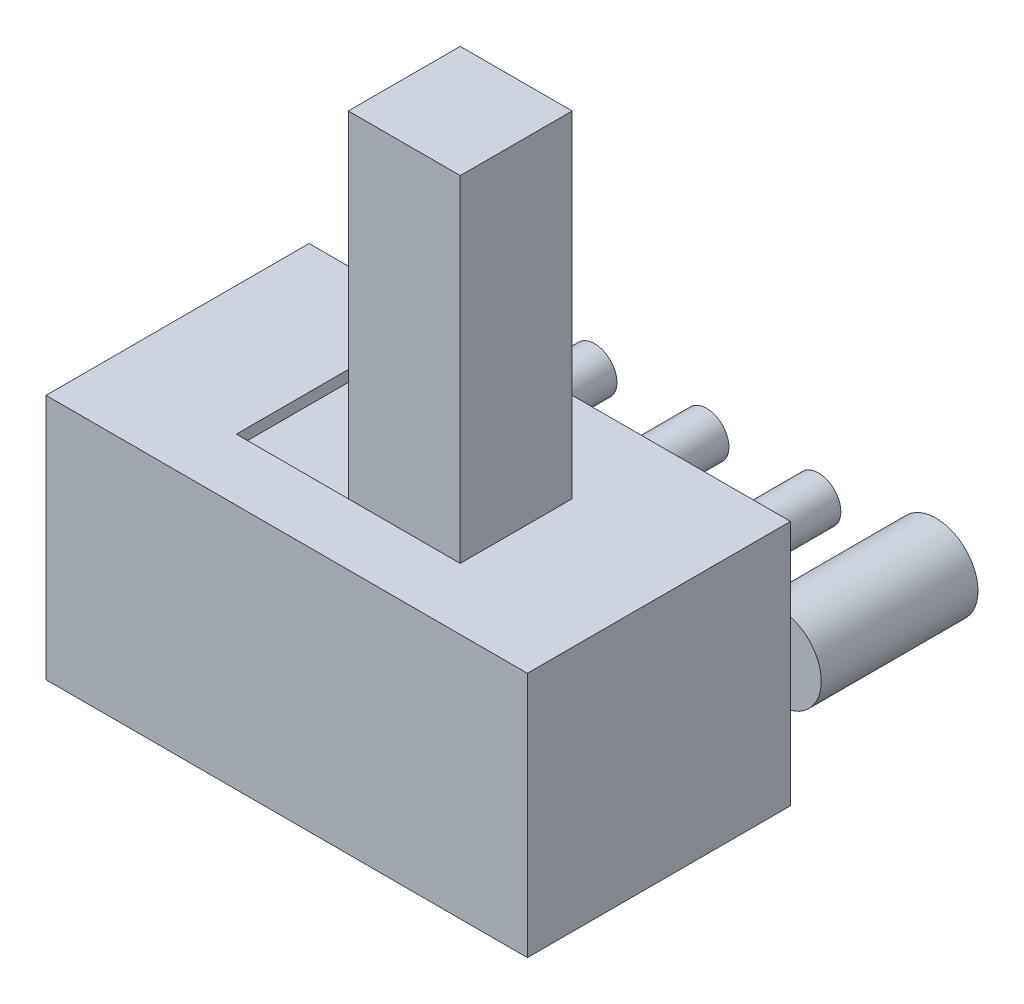
ISO-10303-21;
HEADER;
FILE_DESCRIPTION(('STEP AP214'),'2;1');
FILE_NAME('part.step','',(''),(''),'','','');
FILE_SCHEMA(('AUTOMOTIVE_DESIGN { 1 0 10303 214 1 1 1 1 }'));
ENDSEC;
DATA;
#1=APPLICATION_CONTEXT('core data for automotive mechanical design processes');
#2=APPLICATION_PROTOCOL_DEFINITION('international standard','automotive_design',2000,#1);
#3=PRODUCT_CONTEXT('',#1,'mechanical');
#4=PRODUCT('Part','Part','',(#3));
#5=PRODUCT_RELATED_PRODUCT_CATEGORY('part','',(#4));
#6=PRODUCT_DEFINITION_FORMATION('','',#4);
#7=PRODUCT_DEFINITION_CONTEXT('part definition',#1,'design');
#8=PRODUCT_DEFINITION('design','',#6,#7);
#9=PRODUCT_DEFINITION_SHAPE('','',#8);
#10=(LENGTH_UNIT() NAMED_UNIT(*) SI_UNIT(.MILLI.,.METRE.));
#11=(NAMED_UNIT(*) PLANE_ANGLE_UNIT() SI_UNIT($,.RADIAN.));
#12=(NAMED_UNIT(*) SI_UNIT($,.STERADIAN.) SOLID_ANGLE_UNIT());
#13=UNCERTAINTY_MEASURE_WITH_UNIT(LENGTH_MEASURE(1.E-05),#10,'distance_accuracy_value','');
#14=(GEOMETRIC_REPRESENTATION_CONTEXT(3) GLOBAL_UNCERTAINTY_ASSIGNED_CONTEXT((#13)) GLOBAL_UNIT_ASSIGNED_CONTEXT((#10,
#11,#12)) REPRESENTATION_CONTEXT('',''));
#15=CARTESIAN_POINT('',(0.,0.,0.));
#16=DIRECTION('',(0.,0.,1.));
#17=DIRECTION('',(1.,0.,0.));
#18=AXIS2_PLACEMENT_3D('',#15,#16,#17);
#19=CARTESIAN_POINT('',(278.495996498944,394.374559285752,3.6));
#20=DIRECTION('',(0.,-1.,0.));
#21=DIRECTION('',(0.,0.,-1.));
#22=AXIS2_PLACEMENT_3D('',#19,#20,#21);
#23=PLANE('',#22);
#24=DIRECTION('',(-1.,0.,0.));
#25=VECTOR('',#24,1.);
#26=CARTESIAN_POINT('',(278.495996498944,394.374559285752,1.6));
#27=LINE('',#26,#25);
#28=CARTESIAN_POINT('',(280.495996498944,394.374559285752,1.6));
#29=VERTEX_POINT('',#28);
#30=CARTESIAN_POINT('',(278.495996498944,394.374559285752,1.6));
#31=VERTEX_POINT('',#30);
#32=EDGE_CURVE('P0_E83',#29,#31,#27,.T.);
#33=ORIENTED_EDGE('',*,*,#32,.T.);
#34=DIRECTION('',(0.,0.,-1.));
#35=VECTOR('',#34,1.);
#36=CARTESIAN_POINT('',(278.495996498944,394.374559285752,3.6));
#37=LINE('',#36,#35);
#38=CARTESIAN_POINT('',(278.495996498944,394.374559285752,3.6));
#39=VERTEX_POINT('',#38);
#40=EDGE_CURVE('P0_E71',#39,#31,#37,.T.);
#41=ORIENTED_EDGE('',*,*,#40,.F.);
#42=DIRECTION('',(-1.,0.,0.));
#43=VECTOR('',#42,1.);
#44=CARTESIAN_POINT('',(278.495996498944,394.374559285752,3.6));
#45=LINE('',#44,#43);
#46=CARTESIAN_POINT('',(280.495996498944,394.374559285752,3.6));
#47=VERTEX_POINT('',#46);
#48=EDGE_CURVE('P0_E20',#47,#39,#45,.T.);
#49=ORIENTED_EDGE('',*,*,#48,.F.);
#50=DIRECTION('',(0.,0.,-1.));
#51=VECTOR('',#50,1.);
#52=CARTESIAN_POINT('',(280.495996498944,394.374559285752,3.6));
#53=LINE('',#52,#51);
#54=EDGE_CURVE('P0_E73',#47,#29,#53,.T.);
#55=ORIENTED_EDGE('',*,*,#54,.T.);
#56=EDGE_LOOP('',(#33,#41,#49,#55));
#57=FACE_BOUND('',#56,.T.);
#58=ADVANCED_FACE('P0_F16',(#57),#23,.F.);
#59=CARTESIAN_POINT('',(278.495996498944,394.374559285752,3.6));
#60=DIRECTION('',(1.,0.,0.));
#61=DIRECTION('',(0.,0.,1.));
#62=AXIS2_PLACEMENT_3D('',#59,#60,#61);
#63=PLANE('',#62);
#64=DIRECTION('',(0.,-1.,0.));
#65=VECTOR('',#64,1.);
#66=CARTESIAN_POINT('',(278.495996498944,394.374559285752,1.6));
#67=LINE('',#66,#65);
#68=CARTESIAN_POINT('',(278.495996498944,388.374559285752,1.6));
#69=VERTEX_POINT('',#68);
#70=EDGE_CURVE('P0_E35',#31,#69,#67,.T.);
#71=ORIENTED_EDGE('',*,*,#70,.T.);
#72=DIRECTION('',(0.,0.,-1.));
#73=VECTOR('',#72,1.);
#74=CARTESIAN_POINT('',(278.495996498944,388.374559285752,3.6));
#75=LINE('',#74,#73);
#76=CARTESIAN_POINT('',(278.495996498944,388.374559285752,3.6));
#77=VERTEX_POINT('',#76);
#78=EDGE_CURVE('P0_E68',#77,#69,#75,.T.);
#79=ORIENTED_EDGE('',*,*,#78,.F.);
#80=DIRECTION('',(0.,-1.,0.));
#81=VECTOR('',#80,1.);
#82=CARTESIAN_POINT('',(278.495996498944,394.374559285752,3.6));
#83=LINE('',#82,#81);
#84=EDGE_CURVE('P0_E50',#39,#77,#83,.T.);
#85=ORIENTED_EDGE('',*,*,#84,.F.);
#86=ORIENTED_EDGE('',*,*,#40,.T.);
#87=EDGE_LOOP('',(#71,#79,#85,#86));
#88=FACE_BOUND('',#87,.T.);
#89=ADVANCED_FACE('P0_F67',(#88),#63,.F.);
#90=CARTESIAN_POINT('',(278.495996498944,388.374559285752,3.6));
#91=DIRECTION('',(0.,1.,0.));
#92=DIRECTION('',(-1.,0.,0.));
#93=AXIS2_PLACEMENT_3D('',#90,#91,#92);
#94=PLANE('',#93);
#95=DIRECTION('',(1.,0.,0.));
#96=VECTOR('',#95,1.);
#97=CARTESIAN_POINT('',(278.495996498944,388.374559285752,1.6));
#98=LINE('',#97,#96);
#99=CARTESIAN_POINT('',(280.495996498944,388.374559285752,1.6));
#100=VERTEX_POINT('',#99);
#101=EDGE_CURVE('P0_E65',#69,#100,#98,.T.);
#102=ORIENTED_EDGE('',*,*,#101,.T.);
#103=DIRECTION('',(0.,0.,-1.));
#104=VECTOR('',#103,1.);
#105=CARTESIAN_POINT('',(280.495996498944,388.374559285752,3.6));
#106=LINE('',#105,#104);
#107=CARTESIAN_POINT('',(280.495996498944,388.374559285752,3.6));
#108=VERTEX_POINT('',#107);
#109=EDGE_CURVE('P0_E85',#108,#100,#106,.T.);
#110=ORIENTED_EDGE('',*,*,#109,.F.);
#111=DIRECTION('',(1.,0.,0.));
#112=VECTOR('',#111,1.);
#113=CARTESIAN_POINT('',(278.495996498944,388.374559285752,3.6));
#114=LINE('',#113,#112);
#115=EDGE_CURVE('P0_E26',#77,#108,#114,.T.);
#116=ORIENTED_EDGE('',*,*,#115,.F.);
#117=ORIENTED_EDGE('',*,*,#78,.T.);
#118=EDGE_LOOP('',(#102,#110,#116,#117));
#119=FACE_BOUND('',#118,.T.);
#120=ADVANCED_FACE('P0_F75',(#119),#94,.F.);
#121=CARTESIAN_POINT('',(280.495996498944,394.374559285752,3.6));
#122=DIRECTION('',(-1.,0.,0.));
#123=DIRECTION('',(0.,0.,-1.));
#124=AXIS2_PLACEMENT_3D('',#121,#122,#123);
#125=PLANE('',#124);
#126=DIRECTION('',(0.,1.,0.));
#127=VECTOR('',#126,1.);
#128=CARTESIAN_POINT('',(280.495996498944,394.374559285752,1.6));
#129=LINE('',#128,#127);
#130=EDGE_CURVE('P0_E59',#100,#29,#129,.T.);
#131=ORIENTED_EDGE('',*,*,#130,.T.);
#132=ORIENTED_EDGE('',*,*,#54,.F.);
#133=DIRECTION('',(0.,1.,0.));
#134=VECTOR('',#133,1.);
#135=CARTESIAN_POINT('',(280.495996498944,394.374559285752,3.6));
#136=LINE('',#135,#134);
#137=EDGE_CURVE('P0_E10',#108,#47,#136,.T.);
#138=ORIENTED_EDGE('',*,*,#137,.F.);
#139=ORIENTED_EDGE('',*,*,#109,.T.);
#140=EDGE_LOOP('',(#131,#132,#138,#139));
#141=FACE_BOUND('',#140,.T.);
#142=ADVANCED_FACE('P0_F90',(#141),#125,.F.);
#143=CARTESIAN_POINT('',(280.495996498944,394.374559285752,3.6));
#144=DIRECTION('',(0.,0.,-1.));
#145=DIRECTION('',(0.,1.,0.));
#146=AXIS2_PLACEMENT_3D('',#143,#144,#145);
#147=PLANE('',#146);
#148=ORIENTED_EDGE('',*,*,#48,.T.);
#149=ORIENTED_EDGE('',*,*,#84,.T.);
#150=ORIENTED_EDGE('',*,*,#115,.T.);
#151=ORIENTED_EDGE('',*,*,#137,.T.);
#152=EDGE_LOOP('',(#148,#149,#150,#151));
#153=FACE_BOUND('',#152,.T.);
#154=ADVANCED_FACE('P0_F18',(#153),#147,.F.);
#155=CARTESIAN_POINT('',(280.495996498944,394.374559285752,1.6));
#156=DIRECTION('',(0.,0.,-1.));
#157=DIRECTION('',(0.,1.,0.));
#158=AXIS2_PLACEMENT_3D('',#155,#156,#157);
#159=PLANE('',#158);
#160=ORIENTED_EDGE('',*,*,#32,.F.);
#161=ORIENTED_EDGE('',*,*,#130,.F.);
#162=ORIENTED_EDGE('',*,*,#101,.F.);
#163=ORIENTED_EDGE('',*,*,#70,.F.);
#164=EDGE_LOOP('',(#160,#161,#162,#163));
#165=FACE_BOUND('',#164,.T.);
#166=ADVANCED_FACE('P0_F77',(#165),#159,.T.);
#167=CLOSED_SHELL('',(#58,#89,#120,#142,#154,#166));
#168=MANIFOLD_SOLID_BREP('P0_B1',#167);
#169=CARTESIAN_POINT('',(278.495996498943,386.174559285753,-2.8));
#170=DIRECTION('',(0.,0.,1.));
#171=DIRECTION('',(1.,0.,0.));
#172=AXIS2_PLACEMENT_3D('',#169,#170,#171);
#173=CYLINDRICAL_SURFACE('',#172,0.400000000000012);
#174=CARTESIAN_POINT('',(278.495996498943,386.174559285753,-2.8));
#175=DIRECTION('',(0.,0.,1.));
#176=DIRECTION('',(1.,0.,0.));
#177=AXIS2_PLACEMENT_3D('',#174,#175,#176);
#178=CIRCLE('',#177,0.400000000000012);
#179=CARTESIAN_POINT('',(278.895996498943,386.174559285753,-2.8));
#180=VERTEX_POINT('',#179);
#181=EDGE_CURVE('P1_E23',#180,#180,#178,.T.);
#182=ORIENTED_EDGE('',*,*,#181,.T.);
#183=EDGE_LOOP('',(#182));
#184=FACE_BOUND('',#183,.T.);
#185=CARTESIAN_POINT('',(278.495996498943,386.174559285753,0.));
#186=DIRECTION('',(0.,0.,1.));
#187=DIRECTION('',(1.,0.,0.));
#188=AXIS2_PLACEMENT_3D('',#185,#186,#187);
#189=CIRCLE('',#188,0.400000000000012);
#190=CARTESIAN_POINT('',(278.895996498943,386.174559285753,0.));
#191=VERTEX_POINT('',#190);
#192=EDGE_CURVE('P1_E189',#191,#191,#189,.T.);
#193=ORIENTED_EDGE('',*,*,#192,.F.);
#194=EDGE_LOOP('',(#193));
#195=FACE_BOUND('',#194,.T.);
#196=ADVANCED_FACE('P1_F16',(#184,#195),#173,.T.);
#197=CARTESIAN_POINT('',(278.495996498943,386.174559285753,-2.8));
#198=DIRECTION('',(0.,0.,1.));
#199=DIRECTION('',(1.,0.,0.));
#200=AXIS2_PLACEMENT_3D('',#197,#198,#199);
#201=PLANE('',#200);
#202=ORIENTED_EDGE('',*,*,#181,.F.);
#203=EDGE_LOOP('',(#202));
#204=FACE_BOUND('',#203,.T.);
#205=ADVANCED_FACE('P1_F198',(#204),#201,.F.);
#206=CARTESIAN_POINT('',(274.195996498943,388.374559285753,4.7));
#207=DIRECTION('',(1.,0.,0.));
#208=DIRECTION('',(0.,0.,-1.));
#209=AXIS2_PLACEMENT_3D('',#206,#207,#208);
#210=PLANE('',#209);
#211=DIRECTION('',(0.,-1.,0.));
#212=VECTOR('',#211,1.);
#213=CARTESIAN_POINT('',(274.195996498943,388.374559285753,0.));
#214=LINE('',#213,#212);
#215=CARTESIAN_POINT('',(274.195996498943,388.374559285753,0.));
#216=VERTEX_POINT('',#215);
#217=CARTESIAN_POINT('',(274.195996498943,386.897400900493,0.));
#218=VERTEX_POINT('',#217);
#219=EDGE_CURVE('P1_E166',#216,#218,#214,.T.);
#220=ORIENTED_EDGE('',*,*,#219,.T.);
#221=CARTESIAN_POINT('',(274.195996498943,385.451717671013,0.));
#222=VERTEX_POINT('',#221);
#223=EDGE_CURVE('P1_E170',#218,#222,#214,.T.);
#224=ORIENTED_EDGE('',*,*,#223,.T.);
#225=CARTESIAN_POINT('',(274.195996498943,383.974559285753,0.));
#226=VERTEX_POINT('',#225);
#227=EDGE_CURVE('P1_E152',#222,#226,#214,.T.);
#228=ORIENTED_EDGE('',*,*,#227,.T.);
#229=DIRECTION('',(0.,0.,-1.));
#230=VECTOR('',#229,1.);
#231=CARTESIAN_POINT('',(274.195996498943,383.974559285753,4.7));
#232=LINE('',#231,#230);
#233=CARTESIAN_POINT('',(274.195996498943,383.974559285753,4.7));
#234=VERTEX_POINT('',#233);
#235=EDGE_CURVE('P1_E186',#234,#226,#232,.T.);
#236=ORIENTED_EDGE('',*,*,#235,.F.);
#237=DIRECTION('',(0.,-1.,0.));
#238=VECTOR('',#237,1.);
#239=CARTESIAN_POINT('',(274.195996498943,388.374559285753,4.7));
#240=LINE('',#239,#238);
#241=CARTESIAN_POINT('',(274.195996498943,388.374559285753,4.7));
#242=VERTEX_POINT('',#241);
#243=EDGE_CURVE('P1_E155',#242,#234,#240,.T.);
#244=ORIENTED_EDGE('',*,*,#243,.F.);
#245=DIRECTION('',(0.,0.,-1.));
#246=VECTOR('',#245,1.);
#247=CARTESIAN_POINT('',(274.195996498943,388.374559285753,4.7));
#248=LINE('',#247,#246);
#249=EDGE_CURVE('P1_E165',#242,#216,#248,.T.);
#250=ORIENTED_EDGE('',*,*,#249,.T.);
#251=EDGE_LOOP('',(#220,#224,#228,#236,#244,#250));
#252=FACE_BOUND('',#251,.T.);
#253=ADVANCED_FACE('P1_F205',(#252),#210,.F.);
#254=CARTESIAN_POINT('',(274.195996498943,383.974559285753,4.7));
#255=DIRECTION('',(0.,1.,0.));
#256=DIRECTION('',(0.,0.,1.));
#257=AXIS2_PLACEMENT_3D('',#254,#255,#256);
#258=PLANE('',#257);
#259=DIRECTION('',(1.,0.,0.));
#260=VECTOR('',#259,1.);
#261=CARTESIAN_POINT('',(274.195996498943,383.974559285753,0.));
#262=LINE('',#261,#260);
#263=CARTESIAN_POINT('',(282.795996498943,383.974559285753,0.));
#264=VERTEX_POINT('',#263);
#265=EDGE_CURVE('P1_E169',#226,#264,#262,.T.);
#266=ORIENTED_EDGE('',*,*,#265,.T.);
#267=DIRECTION('',(0.,0.,-1.));
#268=VECTOR('',#267,1.);
#269=CARTESIAN_POINT('',(282.795996498943,383.974559285753,4.7));
#270=LINE('',#269,#268);
#271=CARTESIAN_POINT('',(282.795996498943,383.974559285753,4.7));
#272=VERTEX_POINT('',#271);
#273=EDGE_CURVE('P1_E183',#272,#264,#270,.T.);
#274=ORIENTED_EDGE('',*,*,#273,.F.);
#275=DIRECTION('',(1.,0.,0.));
#276=VECTOR('',#275,1.);
#277=CARTESIAN_POINT('',(274.195996498943,383.974559285753,4.7));
#278=LINE('',#277,#276);
#279=EDGE_CURVE('P1_E158',#234,#272,#278,.T.);
#280=ORIENTED_EDGE('',*,*,#279,.F.);
#281=ORIENTED_EDGE('',*,*,#235,.T.);
#282=EDGE_LOOP('',(#266,#274,#280,#281));
#283=FACE_BOUND('',#282,.T.);
#284=ADVANCED_FACE('P1_F212',(#283),#258,.F.);
#285=CARTESIAN_POINT('',(282.795996498943,388.374559285753,4.7));
#286=DIRECTION('',(-1.,0.,0.));
#287=DIRECTION('',(0.,0.,1.));
#288=AXIS2_PLACEMENT_3D('',#285,#286,#287);
#289=PLANE('',#288);
#290=DIRECTION('',(0.,1.,0.));
#291=VECTOR('',#290,1.);
#292=CARTESIAN_POINT('',(282.795996498943,388.374559285753,0.));
#293=LINE('',#292,#291);
#294=CARTESIAN_POINT('',(282.795996498943,385.451717671013,0.));
#295=VERTEX_POINT('',#294);
#296=EDGE_CURVE('P1_E173',#264,#295,#293,.T.);
#297=ORIENTED_EDGE('',*,*,#296,.T.);
#298=CARTESIAN_POINT('',(282.795996498943,386.897400900493,0.));
#299=VERTEX_POINT('',#298);
#300=EDGE_CURVE('P1_E176',#295,#299,#293,.T.);
#301=ORIENTED_EDGE('',*,*,#300,.T.);
#302=CARTESIAN_POINT('',(282.795996498943,388.374559285753,0.));
#303=VERTEX_POINT('',#302);
#304=EDGE_CURVE('P1_E172',#299,#303,#293,.T.);
#305=ORIENTED_EDGE('',*,*,#304,.T.);
#306=DIRECTION('',(0.,0.,-1.));
#307=VECTOR('',#306,1.);
#308=CARTESIAN_POINT('',(282.795996498943,388.374559285753,4.7));
#309=LINE('',#308,#307);
#310=CARTESIAN_POINT('',(282.795996498943,388.374559285753,4.7));
#311=VERTEX_POINT('',#310);
#312=EDGE_CURVE('P1_E180',#311,#303,#309,.T.);
#313=ORIENTED_EDGE('',*,*,#312,.F.);
#314=DIRECTION('',(0.,1.,0.));
#315=VECTOR('',#314,1.);
#316=CARTESIAN_POINT('',(282.795996498943,388.374559285753,4.7));
#317=LINE('',#316,#315);
#318=EDGE_CURVE('P1_E161',#272,#311,#317,.T.);
#319=ORIENTED_EDGE('',*,*,#318,.F.);
#320=ORIENTED_EDGE('',*,*,#273,.T.);
#321=EDGE_LOOP('',(#297,#301,#305,#313,#319,#320));
#322=FACE_BOUND('',#321,.T.);
#323=ADVANCED_FACE('P1_F218',(#322),#289,.F.);
#324=CARTESIAN_POINT('',(274.195996498943,388.374559285753,4.7));
#325=DIRECTION('',(0.,-1.,0.));
#326=DIRECTION('',(0.,0.,-1.));
#327=AXIS2_PLACEMENT_3D('',#324,#325,#326);
#328=PLANE('',#327);
#329=DIRECTION('',(-1.,0.,0.));
#330=VECTOR('',#329,1.);
#331=CARTESIAN_POINT('',(280.495996498943,388.374559285753,1.6));
#332=LINE('',#331,#330);
#333=CARTESIAN_POINT('',(280.495996498943,388.374559285753,1.6));
#334=VERTEX_POINT('',#333);
#335=CARTESIAN_POINT('',(276.495996498943,388.374559285753,1.6));
#336=VERTEX_POINT('',#335);
#337=EDGE_CURVE('P1_E121',#334,#336,#332,.T.);
#338=ORIENTED_EDGE('',*,*,#337,.F.);
#339=DIRECTION('',(0.,0.,-1.));
#340=VECTOR('',#339,1.);
#341=CARTESIAN_POINT('',(280.495996498943,388.374559285753,3.6));
#342=LINE('',#341,#340);
#343=CARTESIAN_POINT('',(280.495996498943,388.374559285753,3.6));
#344=VERTEX_POINT('',#343);
#345=EDGE_CURVE('P1_E30',#344,#334,#342,.T.);
#346=ORIENTED_EDGE('',*,*,#345,.F.);
#347=DIRECTION('',(1.,0.,0.));
#348=VECTOR('',#347,1.);
#349=CARTESIAN_POINT('',(280.495996498943,388.374559285753,3.6));
#350=LINE('',#349,#348);
#351=CARTESIAN_POINT('',(276.495996498943,388.374559285753,3.6));
#352=VERTEX_POINT('',#351);
#353=EDGE_CURVE('P1_E113',#352,#344,#350,.T.);
#354=ORIENTED_EDGE('',*,*,#353,.F.);
#355=DIRECTION('',(0.,0.,1.));
#356=VECTOR('',#355,1.);
#357=CARTESIAN_POINT('',(276.495996498943,388.374559285753,3.6));
#358=LINE('',#357,#356);
#359=EDGE_CURVE('P1_E115',#336,#352,#358,.T.);
#360=ORIENTED_EDGE('',*,*,#359,.F.);
#361=EDGE_LOOP('',(#338,#346,#354,#360));
#362=FACE_BOUND('',#361,.T.);
#363=DIRECTION('',(-1.,0.,0.));
#364=VECTOR('',#363,1.);
#365=CARTESIAN_POINT('',(274.195996498943,388.374559285753,0.));
#366=LINE('',#365,#364);
#367=EDGE_CURVE('P1_E159',#303,#216,#366,.T.);
#368=ORIENTED_EDGE('',*,*,#367,.T.);
#369=ORIENTED_EDGE('',*,*,#249,.F.);
#370=DIRECTION('',(-1.,0.,0.));
#371=VECTOR('',#370,1.);
#372=CARTESIAN_POINT('',(274.195996498943,388.374559285753,4.7));
#373=LINE('',#372,#371);
#374=EDGE_CURVE('P1_E163',#311,#242,#373,.T.);
#375=ORIENTED_EDGE('',*,*,#374,.F.);
#376=ORIENTED_EDGE('',*,*,#312,.T.);
#377=EDGE_LOOP('',(#368,#369,#375,#376));
#378=FACE_BOUND('',#377,.T.);
#379=ADVANCED_FACE('P1_F222',(#362,#378),#328,.F.);
#380=CARTESIAN_POINT('',(274.195996498943,383.974559285753,4.7));
#381=DIRECTION('',(0.,0.,1.));
#382=DIRECTION('',(1.,0.,0.));
#383=AXIS2_PLACEMENT_3D('',#380,#381,#382);
#384=PLANE('',#383);
#385=ORIENTED_EDGE('',*,*,#243,.T.);
#386=ORIENTED_EDGE('',*,*,#279,.T.);
#387=ORIENTED_EDGE('',*,*,#318,.T.);
#388=ORIENTED_EDGE('',*,*,#374,.T.);
#389=EDGE_LOOP('',(#385,#386,#387,#388));
#390=FACE_BOUND('',#389,.T.);
#391=ADVANCED_FACE('P1_F226',(#390),#384,.T.);
#392=CARTESIAN_POINT('',(274.195996498943,383.974559285753,0.));
#393=DIRECTION('',(0.,0.,1.));
#394=DIRECTION('',(1.,0.,0.));
#395=AXIS2_PLACEMENT_3D('',#392,#393,#394);
#396=PLANE('',#395);
#397=CARTESIAN_POINT('',(276.495996498943,386.174559285753,0.));
#398=DIRECTION('',(0.,0.,1.));
#399=DIRECTION('',(1.,0.,0.));
#400=AXIS2_PLACEMENT_3D('',#397,#398,#399);
#401=CIRCLE('',#400,0.400000000000012);
#402=CARTESIAN_POINT('',(276.895996498943,386.174559285753,0.));
#403=VERTEX_POINT('',#402);
#404=EDGE_CURVE('P1_E133',#403,#403,#401,.T.);
#405=ORIENTED_EDGE('',*,*,#404,.T.);
#406=EDGE_LOOP('',(#405));
#407=FACE_BOUND('',#406,.T.);
#408=CARTESIAN_POINT('',(280.495996498943,386.174559285753,0.));
#409=DIRECTION('',(0.,0.,1.));
#410=DIRECTION('',(1.,0.,0.));
#411=AXIS2_PLACEMENT_3D('',#408,#409,#410);
#412=CIRCLE('',#411,0.400000000000012);
#413=CARTESIAN_POINT('',(280.895996498943,386.174559285753,0.));
#414=VERTEX_POINT('',#413);
#415=EDGE_CURVE('P1_E140',#414,#414,#412,.T.);
#416=ORIENTED_EDGE('',*,*,#415,.T.);
#417=EDGE_LOOP('',(#416));
#418=FACE_BOUND('',#417,.T.);
#419=ORIENTED_EDGE('',*,*,#192,.T.);
#420=EDGE_LOOP('',(#419));
#421=FACE_BOUND('',#420,.T.);
#422=ORIENTED_EDGE('',*,*,#304,.F.);
#423=CARTESIAN_POINT('',(282.595996498943,386.174559285753,0.));
#424=DIRECTION('',(0.,0.,1.));
#425=DIRECTION('',(1.,0.,0.));
#426=AXIS2_PLACEMENT_3D('',#423,#424,#425);
#427=CIRCLE('',#426,0.749999999999973);
#428=EDGE_CURVE('P1_E134',#299,#295,#427,.T.);
#429=ORIENTED_EDGE('',*,*,#428,.T.);
#430=ORIENTED_EDGE('',*,*,#296,.F.);
#431=ORIENTED_EDGE('',*,*,#265,.F.);
#432=ORIENTED_EDGE('',*,*,#227,.F.);
#433=CARTESIAN_POINT('',(274.395996498943,386.174559285753,0.));
#434=DIRECTION('',(0.,0.,1.));
#435=DIRECTION('',(1.,0.,0.));
#436=AXIS2_PLACEMENT_3D('',#433,#434,#435);
#437=CIRCLE('',#436,0.749999999999973);
#438=EDGE_CURVE('P1_E10',#222,#218,#437,.T.);
#439=ORIENTED_EDGE('',*,*,#438,.T.);
#440=ORIENTED_EDGE('',*,*,#219,.F.);
#441=ORIENTED_EDGE('',*,*,#367,.F.);
#442=EDGE_LOOP('',(#422,#429,#430,#431,#432,#439,#440,#441));
#443=FACE_BOUND('',#442,.T.);
#444=ADVANCED_FACE('P1_F194',(#407,#418,#421,#443),#396,.F.);
#445=CARTESIAN_POINT('',(274.395996498943,386.174559285753,0.));
#446=DIRECTION('',(0.,0.,1.));
#447=DIRECTION('',(1.,0.,0.));
#448=AXIS2_PLACEMENT_3D('',#445,#446,#447);
#449=PLANE('',#448);
#450=ORIENTED_EDGE('',*,*,#223,.F.);
#451=CARTESIAN_POINT('',(274.395996498943,386.174559285753,0.));
#452=DIRECTION('',(0.,0.,1.));
#453=DIRECTION('',(1.,0.,0.));
#454=AXIS2_PLACEMENT_3D('',#451,#452,#453);
#455=CIRCLE('',#454,0.749999999999973);
#456=EDGE_CURVE('P1_E146',#218,#222,#455,.T.);
#457=ORIENTED_EDGE('',*,*,#456,.T.);
#458=EDGE_LOOP('',(#450,#457));
#459=FACE_BOUND('',#458,.T.);
#460=ADVANCED_FACE('P1_F230',(#459),#449,.T.);
#461=CARTESIAN_POINT('',(274.395996498943,386.174559285753,-2.8));
#462=DIRECTION('',(0.,0.,1.));
#463=DIRECTION('',(1.,0.,0.));
#464=AXIS2_PLACEMENT_3D('',#461,#462,#463);
#465=CYLINDRICAL_SURFACE('',#464,0.749999999999973);
#466=CARTESIAN_POINT('',(274.395996498943,386.174559285753,-2.8));
#467=DIRECTION('',(0.,0.,1.));
#468=DIRECTION('',(1.,0.,0.));
#469=AXIS2_PLACEMENT_3D('',#466,#467,#468);
#470=CIRCLE('',#469,0.749999999999973);
#471=CARTESIAN_POINT('',(275.145996498943,386.174559285753,-2.8));
#472=VERTEX_POINT('',#471);
#473=EDGE_CURVE('P1_E149',#472,#472,#470,.T.);
#474=ORIENTED_EDGE('',*,*,#473,.T.);
#475=EDGE_LOOP('',(#474));
#476=FACE_BOUND('',#475,.T.);
#477=ORIENTED_EDGE('',*,*,#456,.F.);
#478=ORIENTED_EDGE('',*,*,#438,.F.);
#479=EDGE_LOOP('',(#477,#478));
#480=FACE_BOUND('',#479,.T.);
#481=ADVANCED_FACE('P1_F235',(#476,#480),#465,.T.);
#482=CARTESIAN_POINT('',(274.395996498943,386.174559285753,-2.8));
#483=DIRECTION('',(0.,0.,1.));
#484=DIRECTION('',(1.,0.,0.));
#485=AXIS2_PLACEMENT_3D('',#482,#483,#484);
#486=PLANE('',#485);
#487=ORIENTED_EDGE('',*,*,#473,.F.);
#488=EDGE_LOOP('',(#487));
#489=FACE_BOUND('',#488,.T.);
#490=ADVANCED_FACE('P1_F238',(#489),#486,.F.);
#491=CARTESIAN_POINT('',(280.495996498943,386.174559285753,-2.8));
#492=DIRECTION('',(0.,0.,1.));
#493=DIRECTION('',(1.,0.,0.));
#494=AXIS2_PLACEMENT_3D('',#491,#492,#493);
#495=CYLINDRICAL_SURFACE('',#494,0.400000000000012);
#496=CARTESIAN_POINT('',(280.495996498943,386.174559285753,-2.8));
#497=DIRECTION('',(0.,0.,1.));
#498=DIRECTION('',(1.,0.,0.));
#499=AXIS2_PLACEMENT_3D('',#496,#497,#498);
#500=CIRCLE('',#499,0.400000000000012);
#501=CARTESIAN_POINT('',(280.895996498943,386.174559285753,-2.8));
#502=VERTEX_POINT('',#501);
#503=EDGE_CURVE('P1_E143',#502,#502,#500,.T.);
#504=ORIENTED_EDGE('',*,*,#503,.T.);
#505=EDGE_LOOP('',(#504));
#506=FACE_BOUND('',#505,.T.);
#507=ORIENTED_EDGE('',*,*,#415,.F.);
#508=EDGE_LOOP('',(#507));
#509=FACE_BOUND('',#508,.T.);
#510=ADVANCED_FACE('P1_F245',(#506,#509),#495,.T.);
#511=CARTESIAN_POINT('',(280.495996498943,386.174559285753,-2.8));
#512=DIRECTION('',(0.,0.,1.));
#513=DIRECTION('',(1.,0.,0.));
#514=AXIS2_PLACEMENT_3D('',#511,#512,#513);
#515=PLANE('',#514);
#516=ORIENTED_EDGE('',*,*,#503,.F.);
#517=EDGE_LOOP('',(#516));
#518=FACE_BOUND('',#517,.T.);
#519=ADVANCED_FACE('P1_F249',(#518),#515,.F.);
#520=CARTESIAN_POINT('',(276.495996498943,386.174559285753,-2.8));
#521=DIRECTION('',(0.,0.,1.));
#522=DIRECTION('',(1.,0.,0.));
#523=AXIS2_PLACEMENT_3D('',#520,#521,#522);
#524=CYLINDRICAL_SURFACE('',#523,0.400000000000012);
#525=CARTESIAN_POINT('',(276.495996498943,386.174559285753,-2.8));
#526=DIRECTION('',(0.,0.,1.));
#527=DIRECTION('',(1.,0.,0.));
#528=AXIS2_PLACEMENT_3D('',#525,#526,#527);
#529=CIRCLE('',#528,0.400000000000012);
#530=CARTESIAN_POINT('',(276.895996498943,386.174559285753,-2.8));
#531=VERTEX_POINT('',#530);
#532=EDGE_CURVE('P1_E137',#531,#531,#529,.T.);
#533=ORIENTED_EDGE('',*,*,#532,.T.);
#534=EDGE_LOOP('',(#533));
#535=FACE_BOUND('',#534,.T.);
#536=ORIENTED_EDGE('',*,*,#404,.F.);
#537=EDGE_LOOP('',(#536));
#538=FACE_BOUND('',#537,.T.);
#539=ADVANCED_FACE('P1_F253',(#535,#538),#524,.T.);
#540=CARTESIAN_POINT('',(276.495996498943,386.174559285753,-2.8));
#541=DIRECTION('',(0.,0.,1.));
#542=DIRECTION('',(1.,0.,0.));
#543=AXIS2_PLACEMENT_3D('',#540,#541,#542);
#544=PLANE('',#543);
#545=ORIENTED_EDGE('',*,*,#532,.F.);
#546=EDGE_LOOP('',(#545));
#547=FACE_BOUND('',#546,.T.);
#548=ADVANCED_FACE('P1_F257',(#547),#544,.F.);
#549=CARTESIAN_POINT('',(282.595996498943,386.174559285753,0.));
#550=DIRECTION('',(0.,0.,1.));
#551=DIRECTION('',(1.,0.,0.));
#552=AXIS2_PLACEMENT_3D('',#549,#550,#551);
#553=PLANE('',#552);
#554=ORIENTED_EDGE('',*,*,#300,.F.);
#555=EDGE_CURVE('P1_E37',#295,#299,#427,.T.);
#556=ORIENTED_EDGE('',*,*,#555,.T.);
#557=EDGE_LOOP('',(#554,#556));
#558=FACE_BOUND('',#557,.T.);
#559=ADVANCED_FACE('P1_F261',(#558),#553,.T.);
#560=CARTESIAN_POINT('',(282.595996498943,386.174559285753,-2.8));
#561=DIRECTION('',(0.,0.,1.));
#562=DIRECTION('',(1.,0.,0.));
#563=AXIS2_PLACEMENT_3D('',#560,#561,#562);
#564=CYLINDRICAL_SURFACE('',#563,0.749999999999973);
#565=CARTESIAN_POINT('',(282.595996498943,386.174559285753,-2.8));
#566=DIRECTION('',(0.,0.,1.));
#567=DIRECTION('',(1.,0.,0.));
#568=AXIS2_PLACEMENT_3D('',#565,#566,#567);
#569=CIRCLE('',#568,0.749999999999973);
#570=CARTESIAN_POINT('',(283.345996498943,386.174559285753,-2.8));
#571=VERTEX_POINT('',#570);
#572=EDGE_CURVE('P1_E130',#571,#571,#569,.T.);
#573=ORIENTED_EDGE('',*,*,#572,.T.);
#574=EDGE_LOOP('',(#573));
#575=FACE_BOUND('',#574,.T.);
#576=ORIENTED_EDGE('',*,*,#428,.F.);
#577=ORIENTED_EDGE('',*,*,#555,.F.);
#578=EDGE_LOOP('',(#576,#577));
#579=FACE_BOUND('',#578,.T.);
#580=ADVANCED_FACE('P1_F263',(#575,#579),#564,.T.);
#581=CARTESIAN_POINT('',(282.595996498943,386.174559285753,-2.8));
#582=DIRECTION('',(0.,0.,1.));
#583=DIRECTION('',(1.,0.,0.));
#584=AXIS2_PLACEMENT_3D('',#581,#582,#583);
#585=PLANE('',#584);
#586=ORIENTED_EDGE('',*,*,#572,.F.);
#587=EDGE_LOOP('',(#586));
#588=FACE_BOUND('',#587,.T.);
#589=ADVANCED_FACE('P1_F266',(#588),#585,.F.);
#590=CARTESIAN_POINT('',(280.495996498943,388.174559285753,3.6));
#591=DIRECTION('',(1.,0.,0.));
#592=DIRECTION('',(0.,0.,-1.));
#593=AXIS2_PLACEMENT_3D('',#590,#591,#592);
#594=PLANE('',#593);
#595=ORIENTED_EDGE('',*,*,#345,.T.);
#596=DIRECTION('',(0.,1.,0.));
#597=VECTOR('',#596,1.);
#598=CARTESIAN_POINT('',(280.495996498943,388.174559285753,1.6));
#599=LINE('',#598,#597);
#600=CARTESIAN_POINT('',(280.495996498943,388.174559285753,1.6));
#601=VERTEX_POINT('',#600);
#602=EDGE_CURVE('P1_E91',#601,#334,#599,.T.);
#603=ORIENTED_EDGE('',*,*,#602,.F.);
#604=DIRECTION('',(0.,0.,-1.));
#605=VECTOR('',#604,1.);
#606=CARTESIAN_POINT('',(280.495996498943,388.174559285753,3.6));
#607=LINE('',#606,#605);
#608=CARTESIAN_POINT('',(280.495996498943,388.174559285753,3.6));
#609=VERTEX_POINT('',#608);
#610=EDGE_CURVE('P1_E95',#609,#601,#607,.T.);
#611=ORIENTED_EDGE('',*,*,#610,.F.);
#612=DIRECTION('',(0.,1.,0.));
#613=VECTOR('',#612,1.);
#614=CARTESIAN_POINT('',(280.495996498943,388.174559285753,3.6));
#615=LINE('',#614,#613);
#616=EDGE_CURVE('P1_E125',#609,#344,#615,.T.);
#617=ORIENTED_EDGE('',*,*,#616,.T.);
#618=EDGE_LOOP('',(#595,#603,#611,#617));
#619=FACE_BOUND('',#618,.T.);
#620=ADVANCED_FACE('P1_F93',(#619),#594,.F.);
#621=CARTESIAN_POINT('',(280.495996498943,388.174559285753,3.6));
#622=DIRECTION('',(0.,0.,1.));
#623=DIRECTION('',(1.,0.,0.));
#624=AXIS2_PLACEMENT_3D('',#621,#622,#623);
#625=PLANE('',#624);
#626=ORIENTED_EDGE('',*,*,#353,.T.);
#627=ORIENTED_EDGE('',*,*,#616,.F.);
#628=DIRECTION('',(1.,0.,0.));
#629=VECTOR('',#628,1.);
#630=CARTESIAN_POINT('',(280.495996498943,388.174559285753,3.6));
#631=LINE('',#630,#629);
#632=CARTESIAN_POINT('',(276.495996498943,388.174559285753,3.6));
#633=VERTEX_POINT('',#632);
#634=EDGE_CURVE('P1_E100',#633,#609,#631,.T.);
#635=ORIENTED_EDGE('',*,*,#634,.F.);
#636=DIRECTION('',(0.,1.,0.));
#637=VECTOR('',#636,1.);
#638=CARTESIAN_POINT('',(276.495996498943,388.174559285753,3.6));
#639=LINE('',#638,#637);
#640=EDGE_CURVE('P1_E127',#633,#352,#639,.T.);
#641=ORIENTED_EDGE('',*,*,#640,.T.);
#642=EDGE_LOOP('',(#626,#627,#635,#641));
#643=FACE_BOUND('',#642,.T.);
#644=ADVANCED_FACE('P1_F276',(#643),#625,.F.);
#645=CARTESIAN_POINT('',(276.495996498943,388.174559285753,3.6));
#646=DIRECTION('',(-1.,0.,0.));
#647=DIRECTION('',(0.,0.,1.));
#648=AXIS2_PLACEMENT_3D('',#645,#646,#647);
#649=PLANE('',#648);
#650=ORIENTED_EDGE('',*,*,#359,.T.);
#651=ORIENTED_EDGE('',*,*,#640,.F.);
#652=DIRECTION('',(0.,0.,1.));
#653=VECTOR('',#652,1.);
#654=CARTESIAN_POINT('',(276.495996498943,388.174559285753,3.6));
#655=LINE('',#654,#653);
#656=CARTESIAN_POINT('',(276.495996498943,388.174559285753,1.6));
#657=VERTEX_POINT('',#656);
#658=EDGE_CURVE('P1_E109',#657,#633,#655,.T.);
#659=ORIENTED_EDGE('',*,*,#658,.F.);
#660=DIRECTION('',(0.,1.,0.));
#661=VECTOR('',#660,1.);
#662=CARTESIAN_POINT('',(276.495996498943,388.174559285753,1.6));
#663=LINE('',#662,#661);
#664=EDGE_CURVE('P1_E99',#657,#336,#663,.T.);
#665=ORIENTED_EDGE('',*,*,#664,.T.);
#666=EDGE_LOOP('',(#650,#651,#659,#665));
#667=FACE_BOUND('',#666,.T.);
#668=ADVANCED_FACE('P1_F279',(#667),#649,.F.);
#669=CARTESIAN_POINT('',(280.495996498943,388.174559285753,1.6));
#670=DIRECTION('',(0.,0.,-1.));
#671=DIRECTION('',(-1.,0.,0.));
#672=AXIS2_PLACEMENT_3D('',#669,#670,#671);
#673=PLANE('',#672);
#674=ORIENTED_EDGE('',*,*,#337,.T.);
#675=ORIENTED_EDGE('',*,*,#664,.F.);
#676=DIRECTION('',(-1.,0.,0.));
#677=VECTOR('',#676,1.);
#678=CARTESIAN_POINT('',(280.495996498943,388.174559285753,1.6));
#679=LINE('',#678,#677);
#680=EDGE_CURVE('P1_E103',#601,#657,#679,.T.);
#681=ORIENTED_EDGE('',*,*,#680,.F.);
#682=ORIENTED_EDGE('',*,*,#602,.T.);
#683=EDGE_LOOP('',(#674,#675,#681,#682));
#684=FACE_BOUND('',#683,.T.);
#685=ADVANCED_FACE('P1_F104',(#684),#673,.F.);
#686=CARTESIAN_POINT('',(280.495996498943,388.174559285753,1.6));
#687=DIRECTION('',(0.,1.,0.));
#688=DIRECTION('',(0.,0.,1.));
#689=AXIS2_PLACEMENT_3D('',#686,#687,#688);
#690=PLANE('',#689);
#691=ORIENTED_EDGE('',*,*,#610,.T.);
#692=ORIENTED_EDGE('',*,*,#680,.T.);
#693=ORIENTED_EDGE('',*,*,#658,.T.);
#694=ORIENTED_EDGE('',*,*,#634,.T.);
#695=EDGE_LOOP('',(#691,#692,#693,#694));
#696=FACE_BOUND('',#695,.T.);
#697=ADVANCED_FACE('P1_F111',(#696),#690,.T.);
#698=CLOSED_SHELL('',(#196,#205,#253,#284,#323,#379,#391,#444,#460,#481,#490,#510,#519,#539,
#548,#559,#580,#589,#620,#644,#668,#685,#697));
#699=MANIFOLD_SOLID_BREP('P1_B1',#698);
#700=ADVANCED_BREP_SHAPE_REPRESENTATION('',(#18,#168,#699),#14);
#701=SHAPE_DEFINITION_REPRESENTATION(#9,#700);
ENDSEC;
END-ISO-10303-21;
